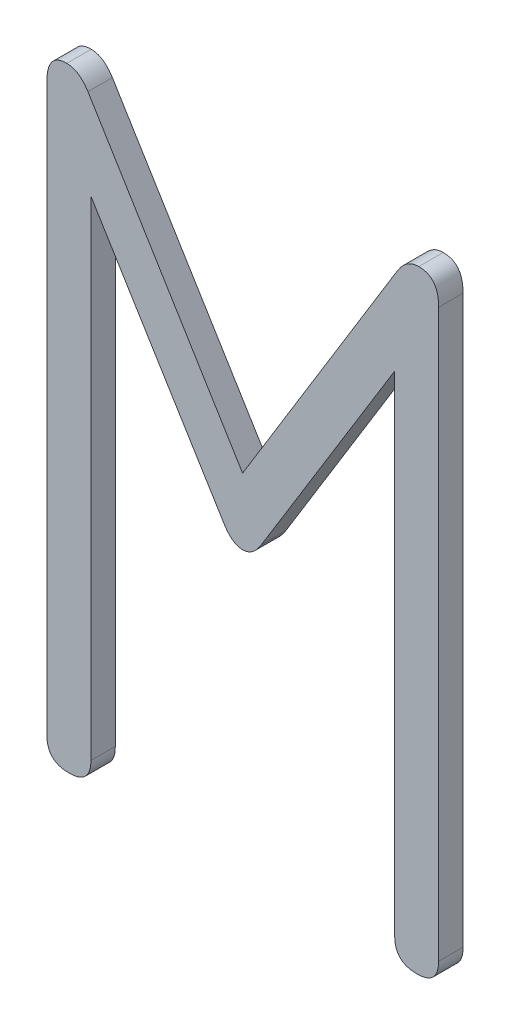
ISO-10303-21;
HEADER;
FILE_DESCRIPTION(('STEP AP214'),'2;1');
FILE_NAME('part.step','',(''),(''),'','','');
FILE_SCHEMA(('AUTOMOTIVE_DESIGN { 1 0 10303 214 1 1 1 1 }'));
ENDSEC;
DATA;
#1=APPLICATION_CONTEXT('core data for automotive mechanical design processes');
#2=APPLICATION_PROTOCOL_DEFINITION('international standard','automotive_design',2000,#1);
#3=PRODUCT_CONTEXT('',#1,'mechanical');
#4=PRODUCT('Part','Part','',(#3));
#5=PRODUCT_RELATED_PRODUCT_CATEGORY('part','',(#4));
#6=PRODUCT_DEFINITION_FORMATION('','',#4);
#7=PRODUCT_DEFINITION_CONTEXT('part definition',#1,'design');
#8=PRODUCT_DEFINITION('design','',#6,#7);
#9=PRODUCT_DEFINITION_SHAPE('','',#8);
#10=(LENGTH_UNIT() NAMED_UNIT(*) SI_UNIT(.MILLI.,.METRE.));
#11=(NAMED_UNIT(*) PLANE_ANGLE_UNIT() SI_UNIT($,.RADIAN.));
#12=(NAMED_UNIT(*) SI_UNIT($,.STERADIAN.) SOLID_ANGLE_UNIT());
#13=UNCERTAINTY_MEASURE_WITH_UNIT(LENGTH_MEASURE(1.E-05),#10,'distance_accuracy_value','');
#14=(GEOMETRIC_REPRESENTATION_CONTEXT(3) GLOBAL_UNCERTAINTY_ASSIGNED_CONTEXT((#13)) GLOBAL_UNIT_ASSIGNED_CONTEXT((#10,
#11,#12)) REPRESENTATION_CONTEXT('',''));
#15=CARTESIAN_POINT('',(0.,0.,0.));
#16=DIRECTION('',(0.,0.,1.));
#17=DIRECTION('',(1.,0.,0.));
#18=AXIS2_PLACEMENT_3D('',#15,#16,#17);
#19=CARTESIAN_POINT('',(0.,0.,1.7));
#20=DIRECTION('',(0.,0.,-1.));
#21=DIRECTION('',(-1.,0.,0.));
#22=AXIS2_PLACEMENT_3D('',#19,#20,#21);
#23=PLANE('',#22);
#24=CARTESIAN_POINT('',(0.863743747472762,-19.5613047798276,1.7));
#25=CARTESIAN_POINT('',(0.945056247472762,-19.5613047798276,1.7));
#26=CARTESIAN_POINT('',(0.945056247472762,-19.6649297798276,1.7));
#27=B_SPLINE_CURVE_WITH_KNOTS('',2,(#24,#25,#26),.UNSPECIFIED.,.F.,.F.,(3,3),(0.,1.),.UNSPECIFIED.);
#28=CARTESIAN_POINT('',(0.863743747472762,-19.5613047798276,1.7));
#29=VERTEX_POINT('',#28);
#30=CARTESIAN_POINT('',(0.945056247472762,-19.6649297798276,1.7));
#31=VERTEX_POINT('',#30);
#32=EDGE_CURVE('E203',#29,#31,#27,.T.);
#33=ORIENTED_EDGE('',*,*,#32,.F.);
#34=CARTESIAN_POINT('',(0.777056247472762,-19.6184922798276,1.7));
#35=CARTESIAN_POINT('',(0.813181247472762,-19.5613047798276,1.7));
#36=CARTESIAN_POINT('',(0.863743747472762,-19.5613047798276,1.7));
#37=B_SPLINE_CURVE_WITH_KNOTS('',2,(#34,#35,#36),.UNSPECIFIED.,.F.,.F.,(3,3),(0.,1.),.UNSPECIFIED.);
#38=CARTESIAN_POINT('',(0.777056247472762,-19.6184922798276,1.7));
#39=VERTEX_POINT('',#38);
#40=EDGE_CURVE('E240',#39,#29,#37,.T.);
#41=ORIENTED_EDGE('',*,*,#40,.F.);
#42=DIRECTION('',(0.522414921436477,0.852691415378694,0.));
#43=VECTOR('',#42,1.);
#44=CARTESIAN_POINT('',(0.142181247472762,-20.6547422798276,1.7));
#45=LINE('',#44,#43);
#46=CARTESIAN_POINT('',(0.142181247472762,-20.6547422798276,1.7));
#47=VERTEX_POINT('',#46);
#48=EDGE_CURVE('E387',#47,#39,#45,.T.);
#49=ORIENTED_EDGE('',*,*,#48,.F.);
#50=DIRECTION('',(0.521366733559253,-0.853332718895599,0.));
#51=VECTOR('',#50,1.);
#52=CARTESIAN_POINT('',(-0.490943752527238,-19.6184922798276,1.7));
#53=LINE('',#52,#51);
#54=CARTESIAN_POINT('',(-0.490943752527238,-19.6184922798276,1.7));
#55=VERTEX_POINT('',#54);
#56=EDGE_CURVE('E381',#55,#47,#53,.T.);
#57=ORIENTED_EDGE('',*,*,#56,.F.);
#58=CARTESIAN_POINT('',(-0.577631252527238,-19.5613047798276,1.7));
#59=CARTESIAN_POINT('',(-0.527068752527238,-19.5613047798276,1.7));
#60=CARTESIAN_POINT('',(-0.490943752527238,-19.6184922798276,1.7));
#61=B_SPLINE_CURVE_WITH_KNOTS('',2,(#58,#59,#60),.UNSPECIFIED.,.F.,.F.,(3,3),(0.,1.),.UNSPECIFIED.);
#62=CARTESIAN_POINT('',(-0.577631252527238,-19.5613047798276,1.7));
#63=VERTEX_POINT('',#62);
#64=EDGE_CURVE('E141',#63,#55,#61,.T.);
#65=ORIENTED_EDGE('',*,*,#64,.F.);
#66=CARTESIAN_POINT('',(-0.658943752527238,-19.6649297798276,1.7));
#67=CARTESIAN_POINT('',(-0.658943752527238,-19.5613047798276,1.7));
#68=CARTESIAN_POINT('',(-0.577631252527238,-19.5613047798276,1.7));
#69=B_SPLINE_CURVE_WITH_KNOTS('',2,(#66,#67,#68),.UNSPECIFIED.,.F.,.F.,(3,3),(0.,1.),.UNSPECIFIED.);
#70=CARTESIAN_POINT('',(-0.658943752527238,-19.6649297798276,1.7));
#71=VERTEX_POINT('',#70);
#72=EDGE_CURVE('E135',#71,#63,#69,.T.);
#73=ORIENTED_EDGE('',*,*,#72,.F.);
#74=DIRECTION('',(0.,1.,0.));
#75=VECTOR('',#74,1.);
#76=CARTESIAN_POINT('',(-0.658943752527239,-21.9839922798276,1.7));
#77=LINE('',#76,#75);
#78=CARTESIAN_POINT('',(-0.658943752527239,-21.9839922798276,1.7));
#79=VERTEX_POINT('',#78);
#80=EDGE_CURVE('E138',#79,#71,#77,.T.);
#81=ORIENTED_EDGE('',*,*,#80,.F.);
#82=CARTESIAN_POINT('',(-0.568943752527238,-22.0733047798276,1.7));
#83=CARTESIAN_POINT('',(-0.658943752527239,-22.0733047798276,1.7));
#84=CARTESIAN_POINT('',(-0.658943752527239,-21.9839922798276,1.7));
#85=B_SPLINE_CURVE_WITH_KNOTS('',2,(#82,#83,#84),.UNSPECIFIED.,.F.,.F.,(3,3),(0.,1.),.UNSPECIFIED.);
#86=CARTESIAN_POINT('',(-0.568943752527238,-22.0733047798276,1.7));
#87=VERTEX_POINT('',#86);
#88=EDGE_CURVE('E166',#79,#87,#85,.F.);
#89=ORIENTED_EDGE('',*,*,#88,.T.);
#90=CARTESIAN_POINT('',(-0.478943752527239,-21.9839922798276,1.7));
#91=CARTESIAN_POINT('',(-0.478943752527239,-22.0733047798276,1.7));
#92=CARTESIAN_POINT('',(-0.568943752527238,-22.0733047798276,1.7));
#93=B_SPLINE_CURVE_WITH_KNOTS('',2,(#90,#91,#92),.UNSPECIFIED.,.F.,.F.,(3,3),(0.,1.),.UNSPECIFIED.);
#94=CARTESIAN_POINT('',(-0.478943752527239,-21.9839922798276,1.7));
#95=VERTEX_POINT('',#94);
#96=EDGE_CURVE('E169',#87,#95,#93,.F.);
#97=ORIENTED_EDGE('',*,*,#96,.T.);
#98=DIRECTION('',(0.,1.,0.));
#99=VECTOR('',#98,1.);
#100=CARTESIAN_POINT('',(-0.478943752527238,-19.9829297798276,1.7));
#101=LINE('',#100,#99);
#102=CARTESIAN_POINT('',(-0.478943752527239,-19.9829297798276,1.7));
#103=VERTEX_POINT('',#102);
#104=EDGE_CURVE('E173',#103,#95,#101,.F.);
#105=ORIENTED_EDGE('',*,*,#104,.F.);
#106=DIRECTION('',(0.522774490299571,-0.852471015514324,0.));
#107=VECTOR('',#106,1.);
#108=CARTESIAN_POINT('',(0.0656187474727617,-20.8709297798276,1.7));
#109=LINE('',#108,#107);
#110=CARTESIAN_POINT('',(0.0656187474727617,-20.8709297798276,1.7));
#111=VERTEX_POINT('',#110);
#112=EDGE_CURVE('E174',#111,#103,#109,.F.);
#113=ORIENTED_EDGE('',*,*,#112,.F.);
#114=CARTESIAN_POINT('',(0.0656187474727617,-20.8709297798276,1.7));
#115=CARTESIAN_POINT('',(0.0681107648435119,-20.8750032538635,1.7));
#116=CARTESIAN_POINT('',(0.0707261291683036,-20.8790090765693,1.7));
#117=CARTESIAN_POINT('',(0.076311573429563,-20.8868725161325,1.7));
#118=CARTESIAN_POINT('',(0.0792871775034041,-20.8907261823793,1.7));
#119=CARTESIAN_POINT('',(0.0864465677852012,-20.8990904109281,1.7));
#120=CARTESIAN_POINT('',(0.0907424753714842,-20.9035079103214,1.7));
#121=CARTESIAN_POINT('',(0.100037475250678,-20.9114890124154,1.7));
#122=CARTESIAN_POINT('',(0.105030425160861,-20.9150594082185,1.7));
#123=CARTESIAN_POINT('',(0.113658951025909,-20.9197754793738,1.7));
#124=CARTESIAN_POINT('',(0.11707218222823,-20.9213248059257,1.7));
#125=CARTESIAN_POINT('',(0.124111200965312,-20.9238238658291,1.7));
#126=CARTESIAN_POINT('',(0.127736751320389,-20.9247742547933,1.7));
#127=CARTESIAN_POINT('',(0.134970240942512,-20.926010407519,1.7));
#128=CARTESIAN_POINT('',(0.138574508050767,-20.9263178777802,1.7));
#129=CARTESIAN_POINT('',(0.142181247472762,-20.9263047798276,1.7));
#130=B_SPLINE_CURVE_WITH_KNOTS('',3,(#114,#115,#116,#117,#118,#119,#120,#121,#122,#123,#124,
#125,#126,#127,#128,#129),.UNSPECIFIED.,.F.,.F.,(4,2,2,2,2,2,2,4),(0.,0.0143333684291312,
0.0289240026356798,0.047344213026871,0.0656112977451506,0.0768100454999927,0.087996513426009,
0.0987987633348686),.UNSPECIFIED.);
#131=CARTESIAN_POINT('',(0.142181247472762,-20.9263047798276,1.7));
#132=VERTEX_POINT('',#131);
#133=EDGE_CURVE('E182',#111,#132,#130,.T.);
#134=ORIENTED_EDGE('',*,*,#133,.T.);
#135=CARTESIAN_POINT('',(0.142181247472762,-20.9263047798276,1.7));
#136=CARTESIAN_POINT('',(0.145947872642313,-20.9263193387889,1.7));
#137=CARTESIAN_POINT('',(0.149710317193998,-20.9259824463176,1.7));
#138=CARTESIAN_POINT('',(0.157081902444901,-20.9246620732999,1.7));
#139=CARTESIAN_POINT('',(0.160692201047071,-20.9236851016115,1.7));
#140=CARTESIAN_POINT('',(0.167691073341765,-20.921140297652,1.7));
#141=CARTESIAN_POINT('',(0.17107984631207,-20.9195730052444,1.7));
#142=CARTESIAN_POINT('',(0.177595960728669,-20.915959056304,1.7));
#143=CARTESIAN_POINT('',(0.180722647770764,-20.9139112456731,1.7));
#144=CARTESIAN_POINT('',(0.188808006037301,-20.9078772837607,1.7));
#145=CARTESIAN_POINT('',(0.193504452826735,-20.9035423165682,1.7));
#146=CARTESIAN_POINT('',(0.202215052663514,-20.8942353256837,1.7));
#147=CARTESIAN_POINT('',(0.206226634455318,-20.8892610190198,1.7));
#148=CARTESIAN_POINT('',(0.213042416975734,-20.8798163529143,1.7));
#149=CARTESIAN_POINT('',(0.215935052891561,-20.8754101522113,1.7));
#150=CARTESIAN_POINT('',(0.218681247472761,-20.8709297798276,1.7));
#151=B_SPLINE_CURVE_WITH_KNOTS('',3,(#135,#136,#137,#138,#139,#140,#141,#142,#143,#144,#145,
#146,#147,#148,#149,#150),.UNSPECIFIED.,.F.,.F.,(4,2,2,2,2,2,2,4),(0.,0.0112765860871666,
0.0224402460036415,0.0335937211592805,0.044774263748163,0.0638359243222347,0.0829676470716886,
0.0987511426448907),.UNSPECIFIED.);
#152=CARTESIAN_POINT('',(0.218681247472761,-20.8709297798276,1.7));
#153=VERTEX_POINT('',#152);
#154=EDGE_CURVE('E23',#132,#153,#151,.T.);
#155=ORIENTED_EDGE('',*,*,#154,.T.);
#156=DIRECTION('',(0.52328896226111,0.852155303906331,0.));
#157=VECTOR('',#156,1.);
#158=CARTESIAN_POINT('',(0.765056247472762,-19.9811797798276,1.7));
#159=LINE('',#158,#157);
#160=CARTESIAN_POINT('',(0.765056247472762,-19.9811797798276,1.7));
#161=VERTEX_POINT('',#160);
#162=EDGE_CURVE('E188',#161,#153,#159,.F.);
#163=ORIENTED_EDGE('',*,*,#162,.F.);
#164=DIRECTION('',(0.,1.,0.));
#165=VECTOR('',#164,1.);
#166=CARTESIAN_POINT('',(0.765056247472762,-21.9839922798276,1.7));
#167=LINE('',#166,#165);
#168=CARTESIAN_POINT('',(0.765056247472762,-21.9839922798276,1.7));
#169=VERTEX_POINT('',#168);
#170=EDGE_CURVE('E189',#169,#161,#167,.T.);
#171=ORIENTED_EDGE('',*,*,#170,.F.);
#172=CARTESIAN_POINT('',(0.855056247472762,-22.0733047798276,1.7));
#173=CARTESIAN_POINT('',(0.765056247472762,-22.0733047798276,1.7));
#174=CARTESIAN_POINT('',(0.765056247472762,-21.9839922798276,1.7));
#175=B_SPLINE_CURVE_WITH_KNOTS('',2,(#172,#173,#174),.UNSPECIFIED.,.F.,.F.,(3,3),(0.,1.),.UNSPECIFIED.);
#176=CARTESIAN_POINT('',(0.855056247472762,-22.0733047798276,1.7));
#177=VERTEX_POINT('',#176);
#178=EDGE_CURVE('E197',#169,#177,#175,.F.);
#179=ORIENTED_EDGE('',*,*,#178,.T.);
#180=CARTESIAN_POINT('',(0.945056247472762,-21.9839922798276,1.7));
#181=CARTESIAN_POINT('',(0.945056247472762,-22.0733047798276,1.7));
#182=CARTESIAN_POINT('',(0.855056247472762,-22.0733047798276,1.7));
#183=B_SPLINE_CURVE_WITH_KNOTS('',2,(#180,#181,#182),.UNSPECIFIED.,.F.,.F.,(3,3),(0.,1.),.UNSPECIFIED.);
#184=CARTESIAN_POINT('',(0.945056247472762,-21.9839922798276,1.7));
#185=VERTEX_POINT('',#184);
#186=EDGE_CURVE('E200',#177,#185,#183,.F.);
#187=ORIENTED_EDGE('',*,*,#186,.T.);
#188=DIRECTION('',(0.,1.,0.));
#189=VECTOR('',#188,1.);
#190=CARTESIAN_POINT('',(0.945056247472762,-19.6649297798276,1.7));
#191=LINE('',#190,#189);
#192=EDGE_CURVE('E201',#31,#185,#191,.F.);
#193=ORIENTED_EDGE('',*,*,#192,.F.);
#194=EDGE_LOOP('',(#33,#41,#49,#57,#65,#73,#81,#89,#97,#105,#113,#134,#155,#163,#171,#179,#187,#193));
#195=FACE_BOUND('',#194,.T.);
#196=ADVANCED_FACE('F17',(#195),#23,.F.);
#197=CARTESIAN_POINT('',(0.945056247472762,-19.6649297798276,1.7));
#198=DIRECTION('',(1.,0.,0.));
#199=DIRECTION('',(0.,0.,-1.));
#200=AXIS2_PLACEMENT_3D('',#197,#198,#199);
#201=PLANE('',#200);
#202=ORIENTED_EDGE('',*,*,#192,.T.);
#203=DIRECTION('',(0.,0.,-1.));
#204=VECTOR('',#203,1.);
#205=CARTESIAN_POINT('',(0.945056247472762,-21.9839922798276,1.65));
#206=LINE('',#205,#204);
#207=CARTESIAN_POINT('',(0.945056247472762,-21.9839922798276,1.6));
#208=VERTEX_POINT('',#207);
#209=EDGE_CURVE('E198',#185,#208,#206,.T.);
#210=ORIENTED_EDGE('',*,*,#209,.T.);
#211=DIRECTION('',(0.,1.,0.));
#212=VECTOR('',#211,1.);
#213=CARTESIAN_POINT('',(0.945056247472762,0.,1.6));
#214=LINE('',#213,#212);
#215=CARTESIAN_POINT('',(0.945056247472762,-19.6649297798276,1.6));
#216=VERTEX_POINT('',#215);
#217=EDGE_CURVE('E362',#216,#208,#214,.F.);
#218=ORIENTED_EDGE('',*,*,#217,.F.);
#219=DIRECTION('',(0.,0.,1.));
#220=VECTOR('',#219,1.);
#221=CARTESIAN_POINT('',(0.945056247472762,-19.6649297798276,1.65));
#222=LINE('',#221,#220);
#223=EDGE_CURVE('E366',#216,#31,#222,.T.);
#224=ORIENTED_EDGE('',*,*,#223,.T.);
#225=EDGE_LOOP('',(#202,#210,#218,#224));
#226=FACE_BOUND('',#225,.T.);
#227=ADVANCED_FACE('F218',(#226),#201,.T.);
#228=CARTESIAN_POINT('',(0.945056247472762,-21.9839922798276,1.7));
#229=CARTESIAN_POINT('',(0.945056247472762,-22.0733047798276,1.7));
#230=CARTESIAN_POINT('',(0.855056247472762,-22.0733047798276,1.7));
#231=CARTESIAN_POINT('',(0.945056247472762,-21.9839922798276,1.6));
#232=CARTESIAN_POINT('',(0.945056247472762,-22.0733047798276,1.6));
#233=CARTESIAN_POINT('',(0.855056247472762,-22.0733047798276,1.6));
#234=B_SPLINE_SURFACE_WITH_KNOTS('',1,2,((#228,#229,#230),(#231,#232,#233)),.UNSPECIFIED.,.F.,
.F.,.F.,(2,2),(3,3),(0.,1.),(0.,1.),.UNSPECIFIED.);
#235=DIRECTION('',(0.,0.,-1.));
#236=VECTOR('',#235,1.);
#237=CARTESIAN_POINT('',(0.855056247472762,-22.0733047798276,1.65));
#238=LINE('',#237,#236);
#239=CARTESIAN_POINT('',(0.855056247472762,-22.0733047798276,1.6));
#240=VERTEX_POINT('',#239);
#241=EDGE_CURVE('E195',#177,#240,#238,.T.);
#242=CARTESIAN_POINT('',(0.945056247472762,-21.9839922798276,1.6));
#243=CARTESIAN_POINT('',(0.945056247472762,-22.0733047798276,1.6));
#244=CARTESIAN_POINT('',(0.855056247472762,-22.0733047798276,1.6));
#245=B_SPLINE_CURVE_WITH_KNOTS('',2,(#242,#243,#244),.UNSPECIFIED.,.F.,.F.,(3,3),(0.,1.),.UNSPECIFIED.);
#246=EDGE_CURVE('E302',#208,#240,#245,.T.);
#247=ORIENTED_EDGE('',*,*,#209,.F.);
#248=ORIENTED_EDGE('',*,*,#186,.F.);
#249=ORIENTED_EDGE('',*,*,#241,.T.);
#250=ORIENTED_EDGE('',*,*,#246,.F.);
#251=EDGE_LOOP('',(#247,#248,#249,#250));
#252=FACE_BOUND('',#251,.T.);
#253=ADVANCED_FACE('F220',(#252),#234,.F.);
#254=CARTESIAN_POINT('',(0.855056247472762,-22.0733047798276,1.7));
#255=CARTESIAN_POINT('',(0.765056247472762,-22.0733047798276,1.7));
#256=CARTESIAN_POINT('',(0.765056247472762,-21.9839922798276,1.7));
#257=CARTESIAN_POINT('',(0.855056247472762,-22.0733047798276,1.6));
#258=CARTESIAN_POINT('',(0.765056247472762,-22.0733047798276,1.6));
#259=CARTESIAN_POINT('',(0.765056247472762,-21.9839922798276,1.6));
#260=B_SPLINE_SURFACE_WITH_KNOTS('',1,2,((#254,#255,#256),(#257,#258,#259)),.UNSPECIFIED.,.F.,
.F.,.F.,(2,2),(3,3),(0.,1.),(0.,1.),.UNSPECIFIED.);
#261=DIRECTION('',(0.,0.,1.));
#262=VECTOR('',#261,1.);
#263=CARTESIAN_POINT('',(0.765056247472762,-21.9839922798276,1.7));
#264=LINE('',#263,#262);
#265=CARTESIAN_POINT('',(0.765056247472762,-21.9839922798276,1.6));
#266=VERTEX_POINT('',#265);
#267=EDGE_CURVE('E192',#266,#169,#264,.T.);
#268=CARTESIAN_POINT('',(0.855056247472762,-22.0733047798276,1.6));
#269=CARTESIAN_POINT('',(0.765056247472762,-22.0733047798276,1.6));
#270=CARTESIAN_POINT('',(0.765056247472762,-21.9839922798276,1.6));
#271=B_SPLINE_CURVE_WITH_KNOTS('',2,(#268,#269,#270),.UNSPECIFIED.,.F.,.F.,(3,3),(0.,1.),.UNSPECIFIED.);
#272=EDGE_CURVE('E306',#240,#266,#271,.T.);
#273=ORIENTED_EDGE('',*,*,#241,.F.);
#274=ORIENTED_EDGE('',*,*,#178,.F.);
#275=ORIENTED_EDGE('',*,*,#267,.F.);
#276=ORIENTED_EDGE('',*,*,#272,.F.);
#277=EDGE_LOOP('',(#273,#274,#275,#276));
#278=FACE_BOUND('',#277,.T.);
#279=ADVANCED_FACE('F427',(#278),#260,.F.);
#280=CARTESIAN_POINT('',(0.765056247472762,-21.9839922798276,1.7));
#281=DIRECTION('',(-1.,0.,0.));
#282=DIRECTION('',(0.,0.,1.));
#283=AXIS2_PLACEMENT_3D('',#280,#281,#282);
#284=PLANE('',#283);
#285=ORIENTED_EDGE('',*,*,#170,.T.);
#286=DIRECTION('',(0.,0.,1.));
#287=VECTOR('',#286,1.);
#288=CARTESIAN_POINT('',(0.765056247472762,-19.9811797798276,1.7));
#289=LINE('',#288,#287);
#290=CARTESIAN_POINT('',(0.765056247472758,-19.9811797798276,1.6));
#291=VERTEX_POINT('',#290);
#292=EDGE_CURVE('E185',#291,#161,#289,.T.);
#293=ORIENTED_EDGE('',*,*,#292,.F.);
#294=DIRECTION('',(0.,1.,0.));
#295=VECTOR('',#294,1.);
#296=CARTESIAN_POINT('',(0.765056247472762,0.,1.6));
#297=LINE('',#296,#295);
#298=EDGE_CURVE('E355',#266,#291,#297,.T.);
#299=ORIENTED_EDGE('',*,*,#298,.F.);
#300=ORIENTED_EDGE('',*,*,#267,.T.);
#301=EDGE_LOOP('',(#285,#293,#299,#300));
#302=FACE_BOUND('',#301,.T.);
#303=ADVANCED_FACE('F410',(#302),#284,.T.);
#304=CARTESIAN_POINT('',(0.765056247472762,-19.9811797798276,1.7));
#305=DIRECTION('',(0.852155303906331,-0.52328896226111,0.));
#306=DIRECTION('',(0.52328896226111,0.852155303906331,0.));
#307=AXIS2_PLACEMENT_3D('',#304,#305,#306);
#308=PLANE('',#307);
#309=ORIENTED_EDGE('',*,*,#162,.T.);
#310=DIRECTION('',(0.,0.,-1.));
#311=VECTOR('',#310,1.);
#312=CARTESIAN_POINT('',(0.218681247472761,-20.8709297798276,1.65));
#313=LINE('',#312,#311);
#314=CARTESIAN_POINT('',(0.218681247472762,-20.8709297798276,1.6));
#315=VERTEX_POINT('',#314);
#316=EDGE_CURVE('E183',#153,#315,#313,.T.);
#317=ORIENTED_EDGE('',*,*,#316,.T.);
#318=DIRECTION('',(-0.523288962261108,-0.852155303906331,0.));
#319=VECTOR('',#318,1.);
#320=CARTESIAN_POINT('',(0.765056247472762,-19.9811797798276,1.6));
#321=LINE('',#320,#319);
#322=EDGE_CURVE('E352',#291,#315,#321,.T.);
#323=ORIENTED_EDGE('',*,*,#322,.F.);
#324=ORIENTED_EDGE('',*,*,#292,.T.);
#325=EDGE_LOOP('',(#309,#317,#323,#324));
#326=FACE_BOUND('',#325,.T.);
#327=ADVANCED_FACE('F417',(#326),#308,.T.);
#328=CARTESIAN_POINT('',(0.218681247472761,-20.8709297798276,1.7));
#329=CARTESIAN_POINT('',(0.184868747472761,-20.9263047798276,1.7));
#330=CARTESIAN_POINT('',(0.142181247472762,-20.9263047798276,1.7));
#331=CARTESIAN_POINT('',(0.218681247472761,-20.8709297798276,1.6));
#332=CARTESIAN_POINT('',(0.184868747472761,-20.9263047798276,1.6));
#333=CARTESIAN_POINT('',(0.142181247472762,-20.9263047798276,1.6));
#334=B_SPLINE_SURFACE_WITH_KNOTS('',1,2,((#328,#329,#330),(#331,#332,#333)),.UNSPECIFIED.,.F.,
.F.,.F.,(2,2),(3,3),(0.,1.),(0.,1.),.UNSPECIFIED.);
#335=DIRECTION('',(0.,0.,-1.));
#336=VECTOR('',#335,1.);
#337=CARTESIAN_POINT('',(0.142181247472762,-20.9263047798276,1.65));
#338=LINE('',#337,#336);
#339=CARTESIAN_POINT('',(0.142181247472762,-20.9263047798276,1.6));
#340=VERTEX_POINT('',#339);
#341=EDGE_CURVE('E180',#132,#340,#338,.T.);
#342=CARTESIAN_POINT('',(0.218681247472761,-20.8709297798276,1.6));
#343=CARTESIAN_POINT('',(0.216188761181897,-20.8750039979495,1.6));
#344=CARTESIAN_POINT('',(0.213573086053554,-20.8790106638339,1.6));
#345=CARTESIAN_POINT('',(0.207987128209059,-20.8868761737549,1.6));
#346=CARTESIAN_POINT('',(0.205011312279667,-20.8907310613551,1.6));
#347=CARTESIAN_POINT('',(0.19785220674059,-20.899097513479,1.6));
#348=CARTESIAN_POINT('',(0.193556925029374,-20.9035161484243,1.6));
#349=CARTESIAN_POINT('',(0.184262971979186,-20.9114996123655,1.6));
#350=CARTESIAN_POINT('',(0.179270460405906,-20.9150712494628,1.6));
#351=CARTESIAN_POINT('',(0.170648707908623,-20.9197843998325,1.6));
#352=CARTESIAN_POINT('',(0.167242666760376,-20.921331036843,1.6));
#353=CARTESIAN_POINT('',(0.160218454294795,-20.9238261805833,1.6));
#354=CARTESIAN_POINT('',(0.15660052257497,-20.92477534916,1.6));
#355=CARTESIAN_POINT('',(0.149380576405941,-20.9260104880279,1.6));
#356=CARTESIAN_POINT('',(0.145782187843375,-20.9263178700869,1.6));
#357=CARTESIAN_POINT('',(0.142181247472762,-20.9263047798276,1.6));
#358=B_SPLINE_CURVE_WITH_KNOTS('',3,(#342,#343,#344,#345,#346,#347,#348,#349,#350,#351,#352,
#353,#354,#355,#356,#357),.UNSPECIFIED.,.F.,.F.,(4,2,2,2,2,2,2,4),(0.,0.0143360191594419,
0.0289299631212965,0.0473514143796431,0.0656193558734955,0.0767952918119285,0.0879588256949577,
0.0987435403152541),.UNSPECIFIED.);
#359=EDGE_CURVE('E250',#315,#340,#358,.T.);
#360=ORIENTED_EDGE('',*,*,#316,.F.);
#361=ORIENTED_EDGE('',*,*,#154,.F.);
#362=ORIENTED_EDGE('',*,*,#341,.T.);
#363=ORIENTED_EDGE('',*,*,#359,.F.);
#364=EDGE_LOOP('',(#360,#361,#362,#363));
#365=FACE_BOUND('',#364,.T.);
#366=ADVANCED_FACE('F263',(#365),#334,.F.);
#367=CARTESIAN_POINT('',(0.142181247472762,-20.9263047798276,1.7));
#368=CARTESIAN_POINT('',(0.0994312474727617,-20.9263047798276,1.7));
#369=CARTESIAN_POINT('',(0.0656187474727617,-20.8709297798276,1.7));
#370=CARTESIAN_POINT('',(0.142181247472762,-20.9263047798276,1.6));
#371=CARTESIAN_POINT('',(0.0994312474727617,-20.9263047798276,1.6));
#372=CARTESIAN_POINT('',(0.0656187474727617,-20.8709297798276,1.6));
#373=B_SPLINE_SURFACE_WITH_KNOTS('',1,2,((#367,#368,#369),(#370,#371,#372)),.UNSPECIFIED.,.F.,
.F.,.F.,(2,2),(3,3),(0.,1.),(0.,1.),.UNSPECIFIED.);
#374=DIRECTION('',(0.,0.,1.));
#375=VECTOR('',#374,1.);
#376=CARTESIAN_POINT('',(0.0656187474727617,-20.8709297798276,1.7));
#377=LINE('',#376,#375);
#378=CARTESIAN_POINT('',(0.0656187474727617,-20.8709297798276,1.6));
#379=VERTEX_POINT('',#378);
#380=EDGE_CURVE('E177',#379,#111,#377,.T.);
#381=CARTESIAN_POINT('',(0.142181247472762,-20.9263047798276,1.6));
#382=CARTESIAN_POINT('',(0.138406559566021,-20.926319370775,1.6));
#383=CARTESIAN_POINT('',(0.134635978589575,-20.9259820143076,1.6));
#384=CARTESIAN_POINT('',(0.127248301283808,-20.9246594145282,1.6));
#385=CARTESIAN_POINT('',(0.123630047828018,-20.9236806782726,1.6));
#386=CARTESIAN_POINT('',(0.116615687869783,-20.9211307221111,1.6));
#387=CARTESIAN_POINT('',(0.113219387869737,-20.9195600265801,1.6));
#388=CARTESIAN_POINT('',(0.10668910712587,-20.9159377745832,1.6));
#389=CARTESIAN_POINT('',(0.103555780858079,-20.9138850640171,1.6));
#390=CARTESIAN_POINT('',(0.0954614574443595,-20.9078418910803,1.6));
#391=CARTESIAN_POINT('',(0.0907624674372618,-20.9035030475256,1.6));
#392=CARTESIAN_POINT('',(0.0820477436852274,-20.8941877255697,1.6));
#393=CARTESIAN_POINT('',(0.0780345755742332,-20.8892089698829,1.6));
#394=CARTESIAN_POINT('',(0.0712323589847211,-20.879777592742,1.6));
#395=CARTESIAN_POINT('',(0.0683528213923593,-20.8753905672689,1.6));
#396=CARTESIAN_POINT('',(0.0656187474727617,-20.8709297798276,1.6));
#397=B_SPLINE_CURVE_WITH_KNOTS('',3,(#381,#382,#383,#384,#385,#386,#387,#388,#389,#390,#391,
#392,#393,#394,#395,#396),.UNSPECIFIED.,.F.,.F.,(4,2,2,2,2,2,2,4),(0.,0.0113008715598345,
0.0224888301738944,0.0336669013705312,0.0448720144103424,0.0639471080850482,0.0830920689701134,
0.0988062795459668),.UNSPECIFIED.);
#398=EDGE_CURVE('E278',#340,#379,#397,.T.);
#399=ORIENTED_EDGE('',*,*,#341,.F.);
#400=ORIENTED_EDGE('',*,*,#133,.F.);
#401=ORIENTED_EDGE('',*,*,#380,.F.);
#402=ORIENTED_EDGE('',*,*,#398,.F.);
#403=EDGE_LOOP('',(#399,#400,#401,#402));
#404=FACE_BOUND('',#403,.T.);
#405=ADVANCED_FACE('F256',(#404),#373,.F.);
#406=CARTESIAN_POINT('',(0.0656187474727617,-20.8709297798276,1.7));
#407=DIRECTION('',(-0.852471015514324,-0.522774490299571,0.));
#408=DIRECTION('',(0.522774490299571,-0.852471015514324,0.));
#409=AXIS2_PLACEMENT_3D('',#406,#407,#408);
#410=PLANE('',#409);
#411=ORIENTED_EDGE('',*,*,#112,.T.);
#412=DIRECTION('',(0.,0.,-1.));
#413=VECTOR('',#412,1.);
#414=CARTESIAN_POINT('',(-0.478943752527238,-19.9829297798276,1.7));
#415=LINE('',#414,#413);
#416=CARTESIAN_POINT('',(-0.478943752527239,-19.9829297798276,1.6));
#417=VERTEX_POINT('',#416);
#418=EDGE_CURVE('E170',#417,#103,#415,.F.);
#419=ORIENTED_EDGE('',*,*,#418,.F.);
#420=DIRECTION('',(-0.52277449029957,0.852471015514325,0.));
#421=VECTOR('',#420,1.);
#422=CARTESIAN_POINT('',(0.0656187474727617,-20.8709297798276,1.6));
#423=LINE('',#422,#421);
#424=EDGE_CURVE('E284',#379,#417,#423,.T.);
#425=ORIENTED_EDGE('',*,*,#424,.F.);
#426=ORIENTED_EDGE('',*,*,#380,.T.);
#427=EDGE_LOOP('',(#411,#419,#425,#426));
#428=FACE_BOUND('',#427,.T.);
#429=ADVANCED_FACE('F262',(#428),#410,.T.);
#430=CARTESIAN_POINT('',(-0.478943752527238,-19.9829297798276,1.7));
#431=DIRECTION('',(1.,0.,0.));
#432=DIRECTION('',(0.,0.,-1.));
#433=AXIS2_PLACEMENT_3D('',#430,#431,#432);
#434=PLANE('',#433);
#435=ORIENTED_EDGE('',*,*,#104,.T.);
#436=DIRECTION('',(0.,0.,-1.));
#437=VECTOR('',#436,1.);
#438=CARTESIAN_POINT('',(-0.478943752527239,-21.9839922798276,1.65));
#439=LINE('',#438,#437);
#440=CARTESIAN_POINT('',(-0.478943752527239,-21.9839922798276,1.6));
#441=VERTEX_POINT('',#440);
#442=EDGE_CURVE('E167',#95,#441,#439,.T.);
#443=ORIENTED_EDGE('',*,*,#442,.T.);
#444=DIRECTION('',(0.,1.,0.));
#445=VECTOR('',#444,1.);
#446=CARTESIAN_POINT('',(-0.478943752527238,0.,1.6));
#447=LINE('',#446,#445);
#448=EDGE_CURVE('E343',#417,#441,#447,.F.);
#449=ORIENTED_EDGE('',*,*,#448,.F.);
#450=ORIENTED_EDGE('',*,*,#418,.T.);
#451=EDGE_LOOP('',(#435,#443,#449,#450));
#452=FACE_BOUND('',#451,.T.);
#453=ADVANCED_FACE('F521',(#452),#434,.T.);
#454=CARTESIAN_POINT('',(-0.478943752527239,-21.9839922798276,1.7));
#455=CARTESIAN_POINT('',(-0.478943752527239,-22.0733047798276,1.7));
#456=CARTESIAN_POINT('',(-0.568943752527238,-22.0733047798276,1.7));
#457=CARTESIAN_POINT('',(-0.478943752527239,-21.9839922798276,1.6));
#458=CARTESIAN_POINT('',(-0.478943752527239,-22.0733047798276,1.6));
#459=CARTESIAN_POINT('',(-0.568943752527238,-22.0733047798276,1.6));
#460=B_SPLINE_SURFACE_WITH_KNOTS('',1,2,((#454,#455,#456),(#457,#458,#459)),.UNSPECIFIED.,.F.,
.F.,.F.,(2,2),(3,3),(0.,1.),(0.,1.),.UNSPECIFIED.);
#461=DIRECTION('',(0.,0.,-1.));
#462=VECTOR('',#461,1.);
#463=CARTESIAN_POINT('',(-0.568943752527238,-22.0733047798276,1.65));
#464=LINE('',#463,#462);
#465=CARTESIAN_POINT('',(-0.568943752527238,-22.0733047798276,1.6));
#466=VERTEX_POINT('',#465);
#467=EDGE_CURVE('E164',#87,#466,#464,.T.);
#468=CARTESIAN_POINT('',(-0.478943752527239,-21.9839922798276,1.6));
#469=CARTESIAN_POINT('',(-0.478943752527239,-22.0733047798276,1.6));
#470=CARTESIAN_POINT('',(-0.568943752527238,-22.0733047798276,1.6));
#471=B_SPLINE_CURVE_WITH_KNOTS('',2,(#468,#469,#470),.UNSPECIFIED.,.F.,.F.,(3,3),(0.,1.),.UNSPECIFIED.);
#472=EDGE_CURVE('E310',#441,#466,#471,.T.);
#473=ORIENTED_EDGE('',*,*,#442,.F.);
#474=ORIENTED_EDGE('',*,*,#96,.F.);
#475=ORIENTED_EDGE('',*,*,#467,.T.);
#476=ORIENTED_EDGE('',*,*,#472,.F.);
#477=EDGE_LOOP('',(#473,#474,#475,#476));
#478=FACE_BOUND('',#477,.T.);
#479=ADVANCED_FACE('F268',(#478),#460,.F.);
#480=CARTESIAN_POINT('',(-0.568943752527238,-22.0733047798276,1.7));
#481=CARTESIAN_POINT('',(-0.658943752527239,-22.0733047798276,1.7));
#482=CARTESIAN_POINT('',(-0.658943752527239,-21.9839922798276,1.7));
#483=CARTESIAN_POINT('',(-0.568943752527238,-22.0733047798276,1.6));
#484=CARTESIAN_POINT('',(-0.658943752527239,-22.0733047798276,1.6));
#485=CARTESIAN_POINT('',(-0.658943752527239,-21.9839922798276,1.6));
#486=B_SPLINE_SURFACE_WITH_KNOTS('',1,2,((#480,#481,#482),(#483,#484,#485)),.UNSPECIFIED.,.F.,
.F.,.F.,(2,2),(3,3),(0.,1.),(0.,1.),.UNSPECIFIED.);
#487=DIRECTION('',(0.,0.,1.));
#488=VECTOR('',#487,1.);
#489=CARTESIAN_POINT('',(-0.658943752527239,-21.9839922798276,1.7));
#490=LINE('',#489,#488);
#491=CARTESIAN_POINT('',(-0.658943752527239,-21.9839922798276,1.6));
#492=VERTEX_POINT('',#491);
#493=EDGE_CURVE('E151',#492,#79,#490,.T.);
#494=CARTESIAN_POINT('',(-0.568943752527238,-22.0733047798276,1.6));
#495=CARTESIAN_POINT('',(-0.658943752527239,-22.0733047798276,1.6));
#496=CARTESIAN_POINT('',(-0.658943752527239,-21.9839922798276,1.6));
#497=B_SPLINE_CURVE_WITH_KNOTS('',2,(#494,#495,#496),.UNSPECIFIED.,.F.,.F.,(3,3),(0.,1.),.UNSPECIFIED.);
#498=EDGE_CURVE('E314',#466,#492,#497,.T.);
#499=ORIENTED_EDGE('',*,*,#467,.F.);
#500=ORIENTED_EDGE('',*,*,#88,.F.);
#501=ORIENTED_EDGE('',*,*,#493,.F.);
#502=ORIENTED_EDGE('',*,*,#498,.F.);
#503=EDGE_LOOP('',(#499,#500,#501,#502));
#504=FACE_BOUND('',#503,.T.);
#505=ADVANCED_FACE('F504',(#504),#486,.F.);
#506=CARTESIAN_POINT('',(-0.658943752527239,-21.9839922798276,1.7));
#507=DIRECTION('',(-1.,0.,0.));
#508=DIRECTION('',(0.,0.,1.));
#509=AXIS2_PLACEMENT_3D('',#506,#507,#508);
#510=PLANE('',#509);
#511=ORIENTED_EDGE('',*,*,#80,.T.);
#512=DIRECTION('',(0.,0.,-1.));
#513=VECTOR('',#512,1.);
#514=CARTESIAN_POINT('',(-0.658943752527238,-19.6649297798276,1.65));
#515=LINE('',#514,#513);
#516=CARTESIAN_POINT('',(-0.658943752527238,-19.6649297798276,1.6));
#517=VERTEX_POINT('',#516);
#518=EDGE_CURVE('E149',#71,#517,#515,.T.);
#519=ORIENTED_EDGE('',*,*,#518,.T.);
#520=DIRECTION('',(0.,1.,0.));
#521=VECTOR('',#520,1.);
#522=CARTESIAN_POINT('',(-0.658943752527239,0.,1.6));
#523=LINE('',#522,#521);
#524=EDGE_CURVE('E341',#492,#517,#523,.T.);
#525=ORIENTED_EDGE('',*,*,#524,.F.);
#526=ORIENTED_EDGE('',*,*,#493,.T.);
#527=EDGE_LOOP('',(#511,#519,#525,#526));
#528=FACE_BOUND('',#527,.T.);
#529=ADVANCED_FACE('F147',(#528),#510,.T.);
#530=CARTESIAN_POINT('',(-0.658943752527238,-19.6649297798276,1.7));
#531=CARTESIAN_POINT('',(-0.658943752527238,-19.5613047798276,1.7));
#532=CARTESIAN_POINT('',(-0.577631252527238,-19.5613047798276,1.7));
#533=CARTESIAN_POINT('',(-0.658943752527238,-19.6649297798276,1.6));
#534=CARTESIAN_POINT('',(-0.658943752527238,-19.5613047798276,1.6));
#535=CARTESIAN_POINT('',(-0.577631252527238,-19.5613047798276,1.6));
#536=B_SPLINE_SURFACE_WITH_KNOTS('',1,2,((#530,#531,#532),(#533,#534,#535)),.UNSPECIFIED.,.F.,
.F.,.F.,(2,2),(3,3),(0.,1.),(0.,1.),.UNSPECIFIED.);
#537=DIRECTION('',(0.,0.,-1.));
#538=VECTOR('',#537,1.);
#539=CARTESIAN_POINT('',(-0.577631252527238,-19.5613047798276,1.65));
#540=LINE('',#539,#538);
#541=CARTESIAN_POINT('',(-0.577631252527238,-19.5613047798276,1.6));
#542=VERTEX_POINT('',#541);
#543=EDGE_CURVE('E157',#63,#542,#540,.T.);
#544=CARTESIAN_POINT('',(-0.658943752527238,-19.6649297798276,1.6));
#545=CARTESIAN_POINT('',(-0.658943752527238,-19.5613047798276,1.6));
#546=CARTESIAN_POINT('',(-0.577631252527238,-19.5613047798276,1.6));
#547=B_SPLINE_CURVE_WITH_KNOTS('',2,(#544,#545,#546),.UNSPECIFIED.,.F.,.F.,(3,3),(0.,1.),.UNSPECIFIED.);
#548=EDGE_CURVE('E155',#517,#542,#547,.T.);
#549=ORIENTED_EDGE('',*,*,#518,.F.);
#550=ORIENTED_EDGE('',*,*,#72,.T.);
#551=ORIENTED_EDGE('',*,*,#543,.T.);
#552=ORIENTED_EDGE('',*,*,#548,.F.);
#553=EDGE_LOOP('',(#549,#550,#551,#552));
#554=FACE_BOUND('',#553,.T.);
#555=ADVANCED_FACE('F153',(#554),#536,.F.);
#556=CARTESIAN_POINT('',(-0.577631252527238,-19.5613047798276,1.7));
#557=CARTESIAN_POINT('',(-0.527068752527238,-19.5613047798276,1.7));
#558=CARTESIAN_POINT('',(-0.490943752527238,-19.6184922798276,1.7));
#559=CARTESIAN_POINT('',(-0.577631252527238,-19.5613047798276,1.6));
#560=CARTESIAN_POINT('',(-0.527068752527238,-19.5613047798276,1.6));
#561=CARTESIAN_POINT('',(-0.490943752527238,-19.6184922798276,1.6));
#562=B_SPLINE_SURFACE_WITH_KNOTS('',1,2,((#556,#557,#558),(#559,#560,#561)),.UNSPECIFIED.,.F.,
.F.,.F.,(2,2),(3,3),(0.,1.),(0.,1.),.UNSPECIFIED.);
#563=DIRECTION('',(0.,0.,1.));
#564=VECTOR('',#563,1.);
#565=CARTESIAN_POINT('',(-0.490943752527238,-19.6184922798276,1.7));
#566=LINE('',#565,#564);
#567=CARTESIAN_POINT('',(-0.490943752527238,-19.6184922798276,1.6));
#568=VERTEX_POINT('',#567);
#569=EDGE_CURVE('E159',#568,#55,#566,.T.);
#570=CARTESIAN_POINT('',(-0.577631252527238,-19.5613047798276,1.6));
#571=CARTESIAN_POINT('',(-0.527068752527238,-19.5613047798276,1.6));
#572=CARTESIAN_POINT('',(-0.490943752527238,-19.6184922798276,1.6));
#573=B_SPLINE_CURVE_WITH_KNOTS('',2,(#570,#571,#572),.UNSPECIFIED.,.F.,.F.,(3,3),(0.,1.),.UNSPECIFIED.);
#574=EDGE_CURVE('E321',#542,#568,#573,.T.);
#575=ORIENTED_EDGE('',*,*,#543,.F.);
#576=ORIENTED_EDGE('',*,*,#64,.T.);
#577=ORIENTED_EDGE('',*,*,#569,.F.);
#578=ORIENTED_EDGE('',*,*,#574,.F.);
#579=EDGE_LOOP('',(#575,#576,#577,#578));
#580=FACE_BOUND('',#579,.T.);
#581=ADVANCED_FACE('F444',(#580),#562,.F.);
#582=CARTESIAN_POINT('',(-0.490943752527238,-19.6184922798276,1.7));
#583=DIRECTION('',(0.853332718895599,0.521366733559253,0.));
#584=DIRECTION('',(-0.521366733559253,0.853332718895599,0.));
#585=AXIS2_PLACEMENT_3D('',#582,#583,#584);
#586=PLANE('',#585);
#587=ORIENTED_EDGE('',*,*,#56,.T.);
#588=DIRECTION('',(0.,0.,1.));
#589=VECTOR('',#588,1.);
#590=CARTESIAN_POINT('',(0.142181247472762,-20.6547422798276,1.7));
#591=LINE('',#590,#589);
#592=CARTESIAN_POINT('',(0.142181247472762,-20.6547422798276,1.6));
#593=VERTEX_POINT('',#592);
#594=EDGE_CURVE('E371',#593,#47,#591,.T.);
#595=ORIENTED_EDGE('',*,*,#594,.F.);
#596=DIRECTION('',(0.521366733559253,-0.853332718895599,0.));
#597=VECTOR('',#596,1.);
#598=CARTESIAN_POINT('',(-0.490943752527238,-19.6184922798276,1.6));
#599=LINE('',#598,#597);
#600=EDGE_CURVE('E332',#568,#593,#599,.T.);
#601=ORIENTED_EDGE('',*,*,#600,.F.);
#602=ORIENTED_EDGE('',*,*,#569,.T.);
#603=EDGE_LOOP('',(#587,#595,#601,#602));
#604=FACE_BOUND('',#603,.T.);
#605=ADVANCED_FACE('F379',(#604),#586,.T.);
#606=CARTESIAN_POINT('',(0.142181247472762,-20.6547422798276,1.7));
#607=DIRECTION('',(-0.852691415378694,0.522414921436477,0.));
#608=DIRECTION('',(-0.522414921436477,-0.852691415378694,0.));
#609=AXIS2_PLACEMENT_3D('',#606,#607,#608);
#610=PLANE('',#609);
#611=ORIENTED_EDGE('',*,*,#48,.T.);
#612=DIRECTION('',(0.,0.,-1.));
#613=VECTOR('',#612,1.);
#614=CARTESIAN_POINT('',(0.777056247472762,-19.6184922798276,1.65));
#615=LINE('',#614,#613);
#616=CARTESIAN_POINT('',(0.777056247472762,-19.6184922798276,1.6));
#617=VERTEX_POINT('',#616);
#618=EDGE_CURVE('E369',#39,#617,#615,.T.);
#619=ORIENTED_EDGE('',*,*,#618,.T.);
#620=DIRECTION('',(0.522414921436477,0.852691415378694,0.));
#621=VECTOR('',#620,1.);
#622=CARTESIAN_POINT('',(0.142181247472762,-20.6547422798276,1.6));
#623=LINE('',#622,#621);
#624=EDGE_CURVE('E325',#593,#617,#623,.T.);
#625=ORIENTED_EDGE('',*,*,#624,.F.);
#626=ORIENTED_EDGE('',*,*,#594,.T.);
#627=EDGE_LOOP('',(#611,#619,#625,#626));
#628=FACE_BOUND('',#627,.T.);
#629=ADVANCED_FACE('F292',(#628),#610,.T.);
#630=CARTESIAN_POINT('',(0.777056247472762,-19.6184922798276,1.7));
#631=CARTESIAN_POINT('',(0.813181247472762,-19.5613047798276,1.7));
#632=CARTESIAN_POINT('',(0.863743747472762,-19.5613047798276,1.7));
#633=CARTESIAN_POINT('',(0.777056247472762,-19.6184922798276,1.6));
#634=CARTESIAN_POINT('',(0.813181247472762,-19.5613047798276,1.6));
#635=CARTESIAN_POINT('',(0.863743747472762,-19.5613047798276,1.6));
#636=B_SPLINE_SURFACE_WITH_KNOTS('',1,2,((#630,#631,#632),(#633,#634,#635)),.UNSPECIFIED.,.F.,
.F.,.F.,(2,2),(3,3),(0.,1.),(0.,1.),.UNSPECIFIED.);
#637=DIRECTION('',(0.,0.,-1.));
#638=VECTOR('',#637,1.);
#639=CARTESIAN_POINT('',(0.863743747472762,-19.5613047798276,1.65));
#640=LINE('',#639,#638);
#641=CARTESIAN_POINT('',(0.863743747472762,-19.5613047798276,1.6));
#642=VERTEX_POINT('',#641);
#643=EDGE_CURVE('E43',#29,#642,#640,.T.);
#644=CARTESIAN_POINT('',(0.777056247472762,-19.6184922798276,1.6));
#645=CARTESIAN_POINT('',(0.813181247472762,-19.5613047798276,1.6));
#646=CARTESIAN_POINT('',(0.863743747472762,-19.5613047798276,1.6));
#647=B_SPLINE_CURVE_WITH_KNOTS('',2,(#644,#645,#646),.UNSPECIFIED.,.F.,.F.,(3,3),(0.,1.),.UNSPECIFIED.);
#648=EDGE_CURVE('E34',#617,#642,#647,.T.);
#649=ORIENTED_EDGE('',*,*,#618,.F.);
#650=ORIENTED_EDGE('',*,*,#40,.T.);
#651=ORIENTED_EDGE('',*,*,#643,.T.);
#652=ORIENTED_EDGE('',*,*,#648,.F.);
#653=EDGE_LOOP('',(#649,#650,#651,#652));
#654=FACE_BOUND('',#653,.T.);
#655=ADVANCED_FACE('F437',(#654),#636,.F.);
#656=CARTESIAN_POINT('',(0.863743747472762,-19.5613047798276,1.7));
#657=CARTESIAN_POINT('',(0.945056247472762,-19.5613047798276,1.7));
#658=CARTESIAN_POINT('',(0.945056247472762,-19.6649297798276,1.7));
#659=CARTESIAN_POINT('',(0.863743747472762,-19.5613047798276,1.6));
#660=CARTESIAN_POINT('',(0.945056247472762,-19.5613047798276,1.6));
#661=CARTESIAN_POINT('',(0.945056247472762,-19.6649297798276,1.6));
#662=B_SPLINE_SURFACE_WITH_KNOTS('',1,2,((#656,#657,#658),(#659,#660,#661)),.UNSPECIFIED.,.F.,
.F.,.F.,(2,2),(3,3),(0.,1.),(0.,1.),.UNSPECIFIED.);
#663=CARTESIAN_POINT('',(0.863743747472762,-19.5613047798276,1.6));
#664=CARTESIAN_POINT('',(0.945056247472762,-19.5613047798276,1.6));
#665=CARTESIAN_POINT('',(0.945056247472762,-19.6649297798276,1.6));
#666=B_SPLINE_CURVE_WITH_KNOTS('',2,(#663,#664,#665),.UNSPECIFIED.,.F.,.F.,(3,3),(0.,1.),.UNSPECIFIED.);
#667=EDGE_CURVE('E11',#642,#216,#666,.T.);
#668=ORIENTED_EDGE('',*,*,#643,.F.);
#669=ORIENTED_EDGE('',*,*,#32,.T.);
#670=ORIENTED_EDGE('',*,*,#223,.F.);
#671=ORIENTED_EDGE('',*,*,#667,.F.);
#672=EDGE_LOOP('',(#668,#669,#670,#671));
#673=FACE_BOUND('',#672,.T.);
#674=ADVANCED_FACE('F19',(#673),#662,.F.);
#675=CARTESIAN_POINT('',(0.,0.,1.6));
#676=DIRECTION('',(0.,0.,-1.));
#677=DIRECTION('',(-1.,0.,0.));
#678=AXIS2_PLACEMENT_3D('',#675,#676,#677);
#679=PLANE('',#678);
#680=ORIENTED_EDGE('',*,*,#648,.T.);
#681=ORIENTED_EDGE('',*,*,#667,.T.);
#682=ORIENTED_EDGE('',*,*,#217,.T.);
#683=ORIENTED_EDGE('',*,*,#246,.T.);
#684=ORIENTED_EDGE('',*,*,#272,.T.);
#685=ORIENTED_EDGE('',*,*,#298,.T.);
#686=ORIENTED_EDGE('',*,*,#322,.T.);
#687=ORIENTED_EDGE('',*,*,#359,.T.);
#688=ORIENTED_EDGE('',*,*,#398,.T.);
#689=ORIENTED_EDGE('',*,*,#424,.T.);
#690=ORIENTED_EDGE('',*,*,#448,.T.);
#691=ORIENTED_EDGE('',*,*,#472,.T.);
#692=ORIENTED_EDGE('',*,*,#498,.T.);
#693=ORIENTED_EDGE('',*,*,#524,.T.);
#694=ORIENTED_EDGE('',*,*,#548,.T.);
#695=ORIENTED_EDGE('',*,*,#574,.T.);
#696=ORIENTED_EDGE('',*,*,#600,.T.);
#697=ORIENTED_EDGE('',*,*,#624,.T.);
#698=EDGE_LOOP('',(#680,#681,#682,#683,#684,#685,#686,#687,#688,#689,#690,#691,#692,#693,#694,
#695,#696,#697));
#699=FACE_BOUND('',#698,.T.);
#700=ADVANCED_FACE('F287',(#699),#679,.T.);
#701=CLOSED_SHELL('',(#196,#227,#253,#279,#303,#327,#366,#405,#429,#453,#479,#505,#529,#555,
#581,#605,#629,#655,#674,#700));
#702=MANIFOLD_SOLID_BREP('B1',#701);
#703=ADVANCED_BREP_SHAPE_REPRESENTATION('',(#18,#702),#14);
#704=SHAPE_DEFINITION_REPRESENTATION(#9,#703);
ENDSEC;
END-ISO-10303-21;
